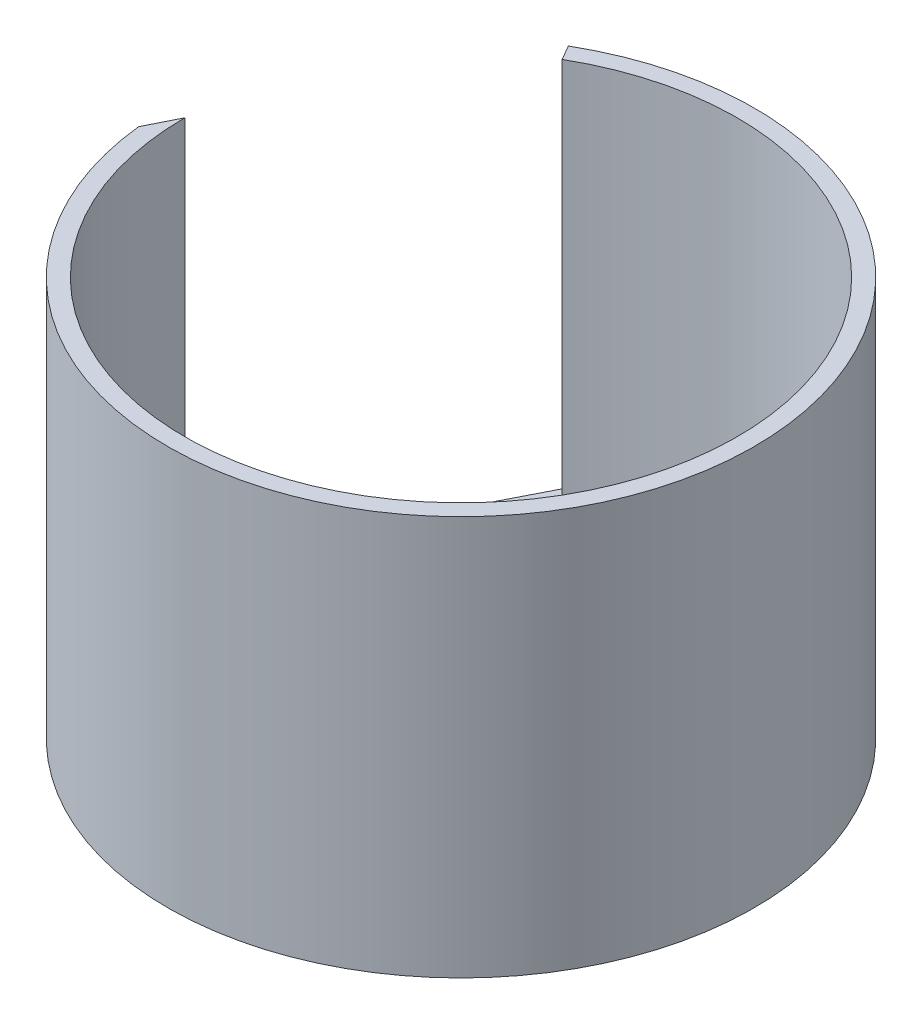
ISO-10303-21;
HEADER;
FILE_DESCRIPTION(('STEP AP214'),'2;1');
FILE_NAME('part.step','',(''),(''),'','','');
FILE_SCHEMA(('AUTOMOTIVE_DESIGN { 1 0 10303 214 1 1 1 1 }'));
ENDSEC;
DATA;
#1=APPLICATION_CONTEXT('core data for automotive mechanical design processes');
#2=APPLICATION_PROTOCOL_DEFINITION('international standard','automotive_design',2000,#1);
#3=PRODUCT_CONTEXT('',#1,'mechanical');
#4=PRODUCT('Part','Part','',(#3));
#5=PRODUCT_RELATED_PRODUCT_CATEGORY('part','',(#4));
#6=PRODUCT_DEFINITION_FORMATION('','',#4);
#7=PRODUCT_DEFINITION_CONTEXT('part definition',#1,'design');
#8=PRODUCT_DEFINITION('design','',#6,#7);
#9=PRODUCT_DEFINITION_SHAPE('','',#8);
#10=(LENGTH_UNIT() NAMED_UNIT(*) SI_UNIT(.MILLI.,.METRE.));
#11=(NAMED_UNIT(*) PLANE_ANGLE_UNIT() SI_UNIT($,.RADIAN.));
#12=(NAMED_UNIT(*) SI_UNIT($,.STERADIAN.) SOLID_ANGLE_UNIT());
#13=UNCERTAINTY_MEASURE_WITH_UNIT(LENGTH_MEASURE(1.E-05),#10,'distance_accuracy_value','');
#14=(GEOMETRIC_REPRESENTATION_CONTEXT(3) GLOBAL_UNCERTAINTY_ASSIGNED_CONTEXT((#13)) GLOBAL_UNIT_ASSIGNED_CONTEXT((#10,
#11,#12)) REPRESENTATION_CONTEXT('',''));
#15=CARTESIAN_POINT('',(0.,0.,0.));
#16=DIRECTION('',(0.,0.,1.));
#17=DIRECTION('',(1.,0.,0.));
#18=AXIS2_PLACEMENT_3D('',#15,#16,#17);
#19=CARTESIAN_POINT('',(0.,0.,0.));
#20=DIRECTION('',(0.,1.,0.));
#21=DIRECTION('',(0.,0.,1.));
#22=AXIS2_PLACEMENT_3D('',#19,#20,#21);
#23=PLANE('',#22);
#24=DIRECTION('',(0.453821251934598,0.,-0.891092740006625));
#25=VECTOR('',#24,1.);
#26=CARTESIAN_POINT('',(-21.9074999999999,0.,-37.9449030668152));
#27=LINE('',#26,#25);
#28=CARTESIAN_POINT('',(-43.5732338645555,0.,4.5964677291109));
#29=VERTEX_POINT('',#28);
#30=CARTESIAN_POINT('',(-41.2749152461669,0.,0.0836446157427145));
#31=VERTEX_POINT('',#30);
#32=EDGE_CURVE('E53',#29,#31,#27,.T.);
#33=ORIENTED_EDGE('',*,*,#32,.F.);
#34=DIRECTION('',(0.447213595499956,0.,-0.894427190999917));
#35=VECTOR('',#34,1.);
#36=CARTESIAN_POINT('',(-41.275,0.,0.));
#37=LINE('',#36,#35);
#38=CARTESIAN_POINT('',(-41.275,0.,0.));
#39=VERTEX_POINT('',#38);
#40=EDGE_CURVE('E12',#29,#39,#37,.T.);
#41=ORIENTED_EDGE('',*,*,#40,.T.);
#42=CARTESIAN_POINT('',(0.,0.,0.));
#43=DIRECTION('',(0.,1.,0.));
#44=DIRECTION('',(0.,0.,1.));
#45=AXIS2_PLACEMENT_3D('',#42,#43,#44);
#46=CIRCLE('',#45,41.275);
#47=EDGE_CURVE('E129',#39,#31,#46,.T.);
#48=ORIENTED_EDGE('',*,*,#47,.T.);
#49=EDGE_LOOP('',(#33,#41,#48));
#50=FACE_BOUND('',#49,.T.);
#51=ADVANCED_FACE('F39',(#50),#23,.F.);
#52=CARTESIAN_POINT('',(0.,57.15,0.));
#53=DIRECTION('',(0.,1.,0.));
#54=DIRECTION('',(0.,0.,1.));
#55=AXIS2_PLACEMENT_3D('',#52,#53,#54);
#56=PLANE('',#55);
#57=CARTESIAN_POINT('',(0.,57.15,0.));
#58=DIRECTION('',(0.,1.,0.));
#59=DIRECTION('',(0.,0.,1.));
#60=AXIS2_PLACEMENT_3D('',#57,#58,#59);
#61=CIRCLE('',#60,41.275);
#62=CARTESIAN_POINT('',(-41.275,57.15,0.));
#63=VERTEX_POINT('',#62);
#64=CARTESIAN_POINT('',(-20.6374999999999,57.15,-35.7451985412028));
#65=VERTEX_POINT('',#64);
#66=EDGE_CURVE('E125',#63,#65,#61,.T.);
#67=ORIENTED_EDGE('',*,*,#66,.F.);
#68=DIRECTION('',(-0.447213595499956,0.,0.894427190999917));
#69=VECTOR('',#68,1.);
#70=CARTESIAN_POINT('',(-33.0200000000001,57.15,-16.5099999999999));
#71=LINE('',#70,#69);
#72=CARTESIAN_POINT('',(-43.5732338645554,57.15,4.5964677291109));
#73=VERTEX_POINT('',#72);
#74=EDGE_CURVE('E61',#63,#73,#71,.T.);
#75=ORIENTED_EDGE('',*,*,#74,.T.);
#76=CARTESIAN_POINT('',(0.,57.15,0.));
#77=DIRECTION('',(0.,1.,0.));
#78=DIRECTION('',(1.,0.,0.));
#79=AXIS2_PLACEMENT_3D('',#76,#77,#78);
#80=CIRCLE('',#79,43.815);
#81=CARTESIAN_POINT('',(-21.9074999999999,57.15,-37.9449030668152));
#82=VERTEX_POINT('',#81);
#83=EDGE_CURVE('E128',#73,#82,#80,.T.);
#84=ORIENTED_EDGE('',*,*,#83,.T.);
#85=DIRECTION('',(-0.499999999999998,0.,-0.86602540378444));
#86=VECTOR('',#85,1.);
#87=CARTESIAN_POINT('',(-20.6374999999999,57.15,-35.7451985412028));
#88=LINE('',#87,#86);
#89=EDGE_CURVE('E106',#65,#82,#88,.T.);
#90=ORIENTED_EDGE('',*,*,#89,.F.);
#91=EDGE_LOOP('',(#67,#75,#84,#90));
#92=FACE_BOUND('',#91,.T.);
#93=ADVANCED_FACE('F133',(#92),#56,.T.);
#94=CARTESIAN_POINT('',(0.,57.15,0.));
#95=DIRECTION('',(0.,-1.,0.));
#96=DIRECTION('',(0.,0.,-1.));
#97=AXIS2_PLACEMENT_3D('',#94,#95,#96);
#98=CYLINDRICAL_SURFACE('',#97,43.815);
#99=ORIENTED_EDGE('',*,*,#83,.F.);
#100=DIRECTION('',(0.,-1.,0.));
#101=VECTOR('',#100,1.);
#102=CARTESIAN_POINT('',(-43.5732338645555,57.15,4.5964677291109));
#103=LINE('',#102,#101);
#104=EDGE_CURVE('E47',#73,#29,#103,.T.);
#105=ORIENTED_EDGE('',*,*,#104,.T.);
#106=DIRECTION('',(0.,1.,0.));
#107=VECTOR('',#106,1.);
#108=CARTESIAN_POINT('',(-43.5732338645555,-2.54,4.5964677291109));
#109=LINE('',#108,#107);
#110=CARTESIAN_POINT('',(-43.5732338645555,-2.54,4.5964677291109));
#111=VERTEX_POINT('',#110);
#112=EDGE_CURVE('E92',#111,#29,#109,.T.);
#113=ORIENTED_EDGE('',*,*,#112,.F.);
#114=CARTESIAN_POINT('',(0.,-2.54,0.));
#115=DIRECTION('',(0.,-1.,0.));
#116=DIRECTION('',(0.,0.,-1.));
#117=AXIS2_PLACEMENT_3D('',#114,#115,#116);
#118=CIRCLE('',#117,43.815);
#119=CARTESIAN_POINT('',(-21.9074999999999,-2.54,-37.9449030668152));
#120=VERTEX_POINT('',#119);
#121=EDGE_CURVE('E98',#120,#111,#118,.T.);
#122=ORIENTED_EDGE('',*,*,#121,.F.);
#123=DIRECTION('',(0.,1.,0.));
#124=VECTOR('',#123,1.);
#125=CARTESIAN_POINT('',(-21.9074999999999,-2.54,-37.9449030668152));
#126=LINE('',#125,#124);
#127=CARTESIAN_POINT('',(-21.9074999999999,0.,-37.9449030668152));
#128=VERTEX_POINT('',#127);
#129=EDGE_CURVE('E95',#120,#128,#126,.T.);
#130=ORIENTED_EDGE('',*,*,#129,.T.);
#131=DIRECTION('',(0.,1.,0.));
#132=VECTOR('',#131,1.);
#133=CARTESIAN_POINT('',(-21.9074999999999,0.,-37.9449030668152));
#134=LINE('',#133,#132);
#135=EDGE_CURVE('E121',#128,#82,#134,.T.);
#136=ORIENTED_EDGE('',*,*,#135,.T.);
#137=EDGE_LOOP('',(#99,#105,#113,#122,#130,#136));
#138=FACE_BOUND('',#137,.T.);
#139=ADVANCED_FACE('F103',(#138),#98,.T.);
#140=CARTESIAN_POINT('',(0.,57.15,0.));
#141=DIRECTION('',(0.,-1.,0.));
#142=DIRECTION('',(0.,0.,-1.));
#143=AXIS2_PLACEMENT_3D('',#140,#141,#142);
#144=CYLINDRICAL_SURFACE('',#143,41.275);
#145=DIRECTION('',(0.,1.,0.));
#146=VECTOR('',#145,1.);
#147=CARTESIAN_POINT('',(-41.275,0.,0.));
#148=LINE('',#147,#146);
#149=EDGE_CURVE('E117',#39,#63,#148,.T.);
#150=ORIENTED_EDGE('',*,*,#149,.T.);
#151=ORIENTED_EDGE('',*,*,#66,.T.);
#152=DIRECTION('',(0.,1.,0.));
#153=VECTOR('',#152,1.);
#154=CARTESIAN_POINT('',(-20.6374999999999,0.,-35.7451985412028));
#155=LINE('',#154,#153);
#156=CARTESIAN_POINT('',(-20.6374999999999,0.,-35.7451985412027));
#157=VERTEX_POINT('',#156);
#158=EDGE_CURVE('E115',#157,#65,#155,.T.);
#159=ORIENTED_EDGE('',*,*,#158,.F.);
#160=EDGE_CURVE('E120',#31,#157,#46,.T.);
#161=ORIENTED_EDGE('',*,*,#160,.F.);
#162=ORIENTED_EDGE('',*,*,#47,.F.);
#163=EDGE_LOOP('',(#150,#151,#159,#161,#162));
#164=FACE_BOUND('',#163,.T.);
#165=ADVANCED_FACE('F140',(#164),#144,.F.);
#166=CARTESIAN_POINT('',(-20.6374999999999,0.,-35.7451985412028));
#167=DIRECTION('',(0.86602540378444,0.,-0.499999999999998));
#168=DIRECTION('',(-0.499999999999998,0.,-0.86602540378444));
#169=AXIS2_PLACEMENT_3D('',#166,#167,#168);
#170=PLANE('',#169);
#171=ORIENTED_EDGE('',*,*,#89,.T.);
#172=ORIENTED_EDGE('',*,*,#135,.F.);
#173=DIRECTION('',(-0.499999999999998,0.,-0.86602540378444));
#174=VECTOR('',#173,1.);
#175=CARTESIAN_POINT('',(-20.6374999999999,0.,-35.7451985412028));
#176=LINE('',#175,#174);
#177=EDGE_CURVE('E109',#157,#128,#176,.T.);
#178=ORIENTED_EDGE('',*,*,#177,.F.);
#179=ORIENTED_EDGE('',*,*,#158,.T.);
#180=EDGE_LOOP('',(#171,#172,#178,#179));
#181=FACE_BOUND('',#180,.T.);
#182=ADVANCED_FACE('F135',(#181),#170,.F.);
#183=CARTESIAN_POINT('',(-41.275,57.15,0.));
#184=DIRECTION('',(-0.894427190999917,0.,-0.447213595499956));
#185=DIRECTION('',(0.,-1.,0.));
#186=AXIS2_PLACEMENT_3D('',#183,#184,#185);
#187=PLANE('',#186);
#188=ORIENTED_EDGE('',*,*,#40,.F.);
#189=ORIENTED_EDGE('',*,*,#104,.F.);
#190=ORIENTED_EDGE('',*,*,#74,.F.);
#191=ORIENTED_EDGE('',*,*,#149,.F.);
#192=EDGE_LOOP('',(#188,#189,#190,#191));
#193=FACE_BOUND('',#192,.T.);
#194=ADVANCED_FACE('F41',(#193),#187,.T.);
#195=CARTESIAN_POINT('',(0.,0.,0.));
#196=DIRECTION('',(0.,-1.,0.));
#197=DIRECTION('',(0.,0.,-1.));
#198=AXIS2_PLACEMENT_3D('',#195,#196,#197);
#199=PLANE('',#198);
#200=EDGE_CURVE('E145',#31,#128,#27,.T.);
#201=ORIENTED_EDGE('',*,*,#200,.F.);
#202=ORIENTED_EDGE('',*,*,#160,.T.);
#203=ORIENTED_EDGE('',*,*,#177,.T.);
#204=EDGE_LOOP('',(#201,#202,#203));
#205=FACE_BOUND('',#204,.T.);
#206=ADVANCED_FACE('F144',(#205),#199,.F.);
#207=CARTESIAN_POINT('',(-21.9074999999999,-2.54,-37.9449030668152));
#208=DIRECTION('',(0.891092740006625,0.,0.453821251934598));
#209=DIRECTION('',(0.453821251934598,0.,-0.891092740006625));
#210=AXIS2_PLACEMENT_3D('',#207,#208,#209);
#211=PLANE('',#210);
#212=ORIENTED_EDGE('',*,*,#32,.T.);
#213=ORIENTED_EDGE('',*,*,#200,.T.);
#214=ORIENTED_EDGE('',*,*,#129,.F.);
#215=DIRECTION('',(0.453821251934598,0.,-0.891092740006625));
#216=VECTOR('',#215,1.);
#217=CARTESIAN_POINT('',(-21.9074999999999,-2.54,-37.9449030668152));
#218=LINE('',#217,#216);
#219=EDGE_CURVE('E88',#111,#120,#218,.T.);
#220=ORIENTED_EDGE('',*,*,#219,.F.);
#221=ORIENTED_EDGE('',*,*,#112,.T.);
#222=EDGE_LOOP('',(#212,#213,#214,#220,#221));
#223=FACE_BOUND('',#222,.T.);
#224=ADVANCED_FACE('F90',(#223),#211,.F.);
#225=CARTESIAN_POINT('',(0.,-2.54,0.));
#226=DIRECTION('',(0.,-1.,0.));
#227=DIRECTION('',(0.,0.,-1.));
#228=AXIS2_PLACEMENT_3D('',#225,#226,#227);
#229=PLANE('',#228);
#230=ORIENTED_EDGE('',*,*,#121,.T.);
#231=ORIENTED_EDGE('',*,*,#219,.T.);
#232=EDGE_LOOP('',(#230,#231));
#233=FACE_BOUND('',#232,.T.);
#234=ADVANCED_FACE('F100',(#233),#229,.T.);
#235=CLOSED_SHELL('',(#51,#93,#139,#165,#182,#194,#206,#224,#234));
#236=MANIFOLD_SOLID_BREP('B2',#235);
#237=ADVANCED_BREP_SHAPE_REPRESENTATION('',(#18,#236),#14);
#238=SHAPE_DEFINITION_REPRESENTATION(#9,#237);
ENDSEC;
END-ISO-10303-21;
